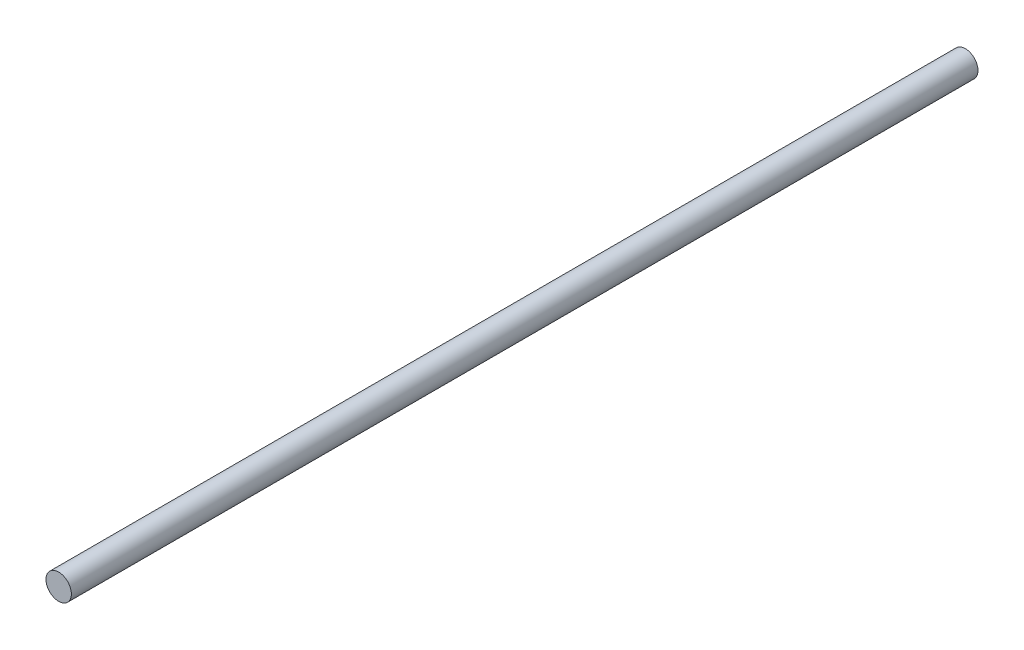
ISO-10303-21;
HEADER;
FILE_DESCRIPTION(('STEP AP214'),'2;1');
FILE_NAME('part.step','',(''),(''),'','','');
FILE_SCHEMA(('AUTOMOTIVE_DESIGN { 1 0 10303 214 1 1 1 1 }'));
ENDSEC;
DATA;
#1=APPLICATION_CONTEXT('core data for automotive mechanical design processes');
#2=APPLICATION_PROTOCOL_DEFINITION('international standard','automotive_design',2000,#1);
#3=PRODUCT_CONTEXT('',#1,'mechanical');
#4=PRODUCT('Part','Part','',(#3));
#5=PRODUCT_RELATED_PRODUCT_CATEGORY('part','',(#4));
#6=PRODUCT_DEFINITION_FORMATION('','',#4);
#7=PRODUCT_DEFINITION_CONTEXT('part definition',#1,'design');
#8=PRODUCT_DEFINITION('design','',#6,#7);
#9=PRODUCT_DEFINITION_SHAPE('','',#8);
#10=(LENGTH_UNIT() NAMED_UNIT(*) SI_UNIT(.MILLI.,.METRE.));
#11=(NAMED_UNIT(*) PLANE_ANGLE_UNIT() SI_UNIT($,.RADIAN.));
#12=(NAMED_UNIT(*) SI_UNIT($,.STERADIAN.) SOLID_ANGLE_UNIT());
#13=UNCERTAINTY_MEASURE_WITH_UNIT(LENGTH_MEASURE(1.E-05),#10,'distance_accuracy_value','');
#14=(GEOMETRIC_REPRESENTATION_CONTEXT(3) GLOBAL_UNCERTAINTY_ASSIGNED_CONTEXT((#13)) GLOBAL_UNIT_ASSIGNED_CONTEXT((#10,
#11,#12)) REPRESENTATION_CONTEXT('',''));
#15=CARTESIAN_POINT('',(0.,0.,0.));
#16=DIRECTION('',(0.,0.,1.));
#17=DIRECTION('',(1.,0.,0.));
#18=AXIS2_PLACEMENT_3D('',#15,#16,#17);
#19=CARTESIAN_POINT('',(0.,0.,250.));
#20=DIRECTION('',(0.,0.,-1.));
#21=DIRECTION('',(-1.,0.,0.));
#22=AXIS2_PLACEMENT_3D('',#19,#20,#21);
#23=CYLINDRICAL_SURFACE('',#22,3.5);
#24=CARTESIAN_POINT('',(0.,0.,250.));
#25=DIRECTION('',(0.,0.,1.));
#26=DIRECTION('',(1.,0.,0.));
#27=AXIS2_PLACEMENT_3D('',#24,#25,#26);
#28=CIRCLE('',#27,3.5);
#29=CARTESIAN_POINT('',(3.5,0.,250.));
#30=VERTEX_POINT('',#29);
#31=EDGE_CURVE('E10',#30,#30,#28,.T.);
#32=ORIENTED_EDGE('',*,*,#31,.F.);
#33=EDGE_LOOP('',(#32));
#34=FACE_BOUND('',#33,.T.);
#35=CARTESIAN_POINT('',(0.,0.,0.));
#36=DIRECTION('',(0.,0.,1.));
#37=DIRECTION('',(1.,0.,0.));
#38=AXIS2_PLACEMENT_3D('',#35,#36,#37);
#39=CIRCLE('',#38,3.5);
#40=CARTESIAN_POINT('',(3.5,0.,0.));
#41=VERTEX_POINT('',#40);
#42=EDGE_CURVE('E44',#41,#41,#39,.T.);
#43=ORIENTED_EDGE('',*,*,#42,.T.);
#44=EDGE_LOOP('',(#43));
#45=FACE_BOUND('',#44,.T.);
#46=ADVANCED_FACE('F41',(#34,#45),#23,.T.);
#47=CARTESIAN_POINT('',(0.,0.,250.));
#48=DIRECTION('',(0.,0.,1.));
#49=DIRECTION('',(1.,0.,0.));
#50=AXIS2_PLACEMENT_3D('',#47,#48,#49);
#51=PLANE('',#50);
#52=ORIENTED_EDGE('',*,*,#31,.T.);
#53=EDGE_LOOP('',(#52));
#54=FACE_BOUND('',#53,.T.);
#55=ADVANCED_FACE('F58',(#54),#51,.T.);
#56=CARTESIAN_POINT('',(0.,0.,0.));
#57=DIRECTION('',(0.,0.,1.));
#58=DIRECTION('',(1.,0.,0.));
#59=AXIS2_PLACEMENT_3D('',#56,#57,#58);
#60=PLANE('',#59);
#61=ORIENTED_EDGE('',*,*,#42,.F.);
#62=EDGE_LOOP('',(#61));
#63=FACE_BOUND('',#62,.T.);
#64=ADVANCED_FACE('F56',(#63),#60,.F.);
#65=CLOSED_SHELL('',(#46,#55,#64));
#66=MANIFOLD_SOLID_BREP('B2',#65);
#67=ADVANCED_BREP_SHAPE_REPRESENTATION('',(#18,#66),#14);
#68=SHAPE_DEFINITION_REPRESENTATION(#9,#67);
ENDSEC;
END-ISO-10303-21;
